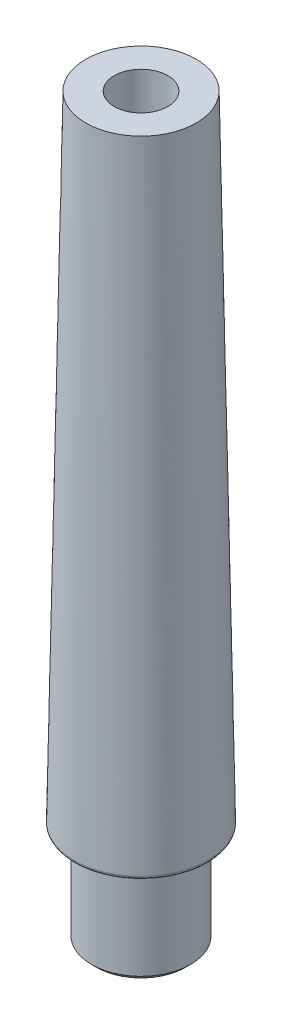
ISO-10303-21;
HEADER;
FILE_DESCRIPTION(('STEP AP214'),'2;1');
FILE_NAME('part.step','',(''),(''),'','','');
FILE_SCHEMA(('AUTOMOTIVE_DESIGN { 1 0 10303 214 1 1 1 1 }'));
ENDSEC;
DATA;
#1=APPLICATION_CONTEXT('core data for automotive mechanical design processes');
#2=APPLICATION_PROTOCOL_DEFINITION('international standard','automotive_design',2000,#1);
#3=PRODUCT_CONTEXT('',#1,'mechanical');
#4=PRODUCT('Part','Part','',(#3));
#5=PRODUCT_RELATED_PRODUCT_CATEGORY('part','',(#4));
#6=PRODUCT_DEFINITION_FORMATION('','',#4);
#7=PRODUCT_DEFINITION_CONTEXT('part definition',#1,'design');
#8=PRODUCT_DEFINITION('design','',#6,#7);
#9=PRODUCT_DEFINITION_SHAPE('','',#8);
#10=(LENGTH_UNIT() NAMED_UNIT(*) SI_UNIT(.MILLI.,.METRE.));
#11=(NAMED_UNIT(*) PLANE_ANGLE_UNIT() SI_UNIT($,.RADIAN.));
#12=(NAMED_UNIT(*) SI_UNIT($,.STERADIAN.) SOLID_ANGLE_UNIT());
#13=UNCERTAINTY_MEASURE_WITH_UNIT(LENGTH_MEASURE(1.E-05),#10,'distance_accuracy_value','');
#14=(GEOMETRIC_REPRESENTATION_CONTEXT(3) GLOBAL_UNCERTAINTY_ASSIGNED_CONTEXT((#13)) GLOBAL_UNIT_ASSIGNED_CONTEXT((#10,
#11,#12)) REPRESENTATION_CONTEXT('',''));
#15=CARTESIAN_POINT('',(0.,0.,0.));
#16=DIRECTION('',(0.,0.,1.));
#17=DIRECTION('',(1.,0.,0.));
#18=AXIS2_PLACEMENT_3D('',#15,#16,#17);
#19=CARTESIAN_POINT('',(0.,0.,0.));
#20=DIRECTION('',(0.,1.,0.));
#21=DIRECTION('',(0.,0.,1.));
#22=AXIS2_PLACEMENT_3D('',#19,#20,#21);
#23=PLANE('',#22);
#24=CARTESIAN_POINT('',(0.20959174613671,0.101841920504854,1.98724148629484));
#25=CARTESIAN_POINT('',(0.209786624715164,0.,1.98910750326632));
#26=CARTESIAN_POINT('',(0.199206440720225,0.,1.88779927815232));
#27=CARTESIAN_POINT('',(0.0986344808680384,0.101841837300837,1.99886008729085));
#28=CARTESIAN_POINT('',(0.0987257454415597,0.,2.00073693716713));
#29=CARTESIAN_POINT('',(0.0937731697168959,0.,1.89883526144194));
#30=CARTESIAN_POINT('',(-0.0131906222906671,0.101841791231215,2.00119648259656));
#31=CARTESIAN_POINT('',(-0.0132023273936145,0.,2.00307543820199));
#32=CARTESIAN_POINT('',(-0.0125705669595942,0.,1.9010570658988));
#33=CARTESIAN_POINT('',(-0.235841117106852,0.101841901744317,1.98740265066842));
#34=CARTESIAN_POINT('',(-0.236060197897312,0.,1.98926876827983));
#35=CARTESIAN_POINT('',(-0.22416516440641,0.,1.88795439500697));
#36=CARTESIAN_POINT('',(-0.346666687767183,0.101842058289998,1.97127579890718));
#37=CARTESIAN_POINT('',(-0.346990403742217,0.,1.97312695126309));
#38=CARTESIAN_POINT('',(-0.329416221392443,0.,1.87263312690344));
#39=CARTESIAN_POINT('',(-0.56541547290951,0.101842186376675,1.92023127720296));
#40=CARTESIAN_POINT('',(-0.565946254422076,0.,1.92203429641829));
#41=CARTESIAN_POINT('',(-0.537137694762737,0.,1.82415975369286));
#42=CARTESIAN_POINT('',(-0.673285045974327,0.101842155579139,1.88508109449888));
#43=CARTESIAN_POINT('',(-0.673917997721037,0.,1.88685075801916));
#44=CARTESIAN_POINT('',(-0.639556864284883,0.,1.79078701724868));
#45=CARTESIAN_POINT('',(-0.881439361014599,0.101841981642428,1.79698698989993));
#46=CARTESIAN_POINT('',(-0.88226888955693,0.,1.79867325541912));
#47=CARTESIAN_POINT('',(-0.837231737795207,0.,1.70712776837986));
#48=CARTESIAN_POINT('',(-0.981723601332979,0.101841838495831,1.74404189239411));
#49=CARTESIAN_POINT('',(-0.982647423425523,0.,1.74567818074565));
#50=CARTESIAN_POINT('',(-0.93248696799286,0.,1.6568401384822));
#51=CARTESIAN_POINT('',(-1.17082140912983,0.101841590496715,1.62273910342765));
#52=CARTESIAN_POINT('',(-1.17192231365546,0.,1.62426149584078));
#53=CARTESIAN_POINT('',(-1.11213934591246,0.,1.5415960026344));
#54=CARTESIAN_POINT('',(-1.25975128925553,0.101841485231657,1.55456143208162));
#55=CARTESIAN_POINT('',(-1.26093514642247,0.,1.55602006729398));
#56=CARTESIAN_POINT('',(-1.19664655330296,0.,1.47681081714188));
#57=CARTESIAN_POINT('',(-1.42508823373414,0.101841410837962,1.40443438367608));
#58=CARTESIAN_POINT('',(-1.42642613629574,0.,1.40575304219463));
#59=CARTESIAN_POINT('',(-1.35376867067339,0.,1.33414262592228));
#60=CARTESIAN_POINT('',(-1.50149489670984,0.101841441713686,1.32248456538077));
#61=CARTESIAN_POINT('',(-1.50290401116512,0.,1.32372690501835));
#62=CARTESIAN_POINT('',(-1.42638319948523,0.,1.25625920055017));
#63=CARTESIAN_POINT('',(-1.64053792342395,0.101841612104352,1.14592139070564));
#64=CARTESIAN_POINT('',(-1.64207697560821,0.,1.14699900264148));
#65=CARTESIAN_POINT('',(-1.55850740992732,0.,1.08848284124485));
#66=CARTESIAN_POINT('',(-1.70299168055144,0.101841752962407,1.05116353471164));
#67=CARTESIAN_POINT('',(-1.70458935704374,0.,1.05215249091494));
#68=CARTESIAN_POINT('',(-1.61784332479958,0.,0.998452896179452));
#69=CARTESIAN_POINT('',(-1.81096664176235,0.10184200564456,0.852416994059184));
#70=CARTESIAN_POINT('',(-1.81266610235884,0.,0.853219192092193));
#71=CARTESIAN_POINT('',(-1.72040644131914,0.,0.809665948354415));
#72=CARTESIAN_POINT('',(-1.85649266420474,0.101842117476917,0.74843094659457));
#73=CARTESIAN_POINT('',(-1.85823525128062,0.,0.749135062295837));
#74=CARTESIAN_POINT('',(-1.76363822689844,0.,0.710911438900184));
#75=CARTESIAN_POINT('',(-1.92885375460445,0.101842172342417,0.535025753641892));
#76=CARTESIAN_POINT('',(-1.93066489784057,0.,0.535527658658716));
#77=CARTESIAN_POINT('',(-1.83234982263291,0.,0.508281406563452));
#78=CARTESIAN_POINT('',(-1.95583449057663,0.101842116710001,0.425656354642715));
#79=CARTESIAN_POINT('',(-1.95767113515226,0.,0.426054364088914));
#80=CARTESIAN_POINT('',(-1.85796798331764,0.,0.40445281950068));
#81=CARTESIAN_POINT('',(-1.99098800236601,0.101841923071748,0.204061205011475));
#82=CARTESIAN_POINT('',(-1.99285757325564,0.,0.204250990183228));
#83=CARTESIAN_POINT('',(-1.89135592167895,0.,0.193948033647154));
#84=CARTESIAN_POINT('',(-1.99915397369964,0.101841785036131,0.0918344358236031));
#85=CARTESIAN_POINT('',(-2.00103096685221,0.,0.091919987984703));
#86=CARTESIAN_POINT('',(-1.89911924203307,0.,0.0872708187364532));
#87=CARTESIAN_POINT('',(-1.99688999671173,0.101841804047459,-0.132589258243576));
#88=CARTESIAN_POINT('',(-1.99876488502683,0.,-0.132712388334099));
#89=CARTESIAN_POINT('',(-1.89696867780493,0.,-0.12602350570676));
#90=CARTESIAN_POINT('',(-1.9864398842953,0.101841961414381,-0.244786018949943));
#91=CARTESIAN_POINT('',(-1.98830522189657,0.,-0.245013936731857));
#92=CARTESIAN_POINT('',(-1.88703562531587,0.,-0.232640424787774));
#93=CARTESIAN_POINT('',(-1.9466897496961,0.101842147984246,-0.46587881631567));
#94=CARTESIAN_POINT('',(-1.94851778331479,0.,-0.466315042044062));
#95=CARTESIAN_POINT('',(-1.84928357403477,0.,-0.442639662116363));
#96=CARTESIAN_POINT('',(-1.91739690977817,0.10184217723599,-0.574776094082254));
#97=CARTESIAN_POINT('',(-1.91919720507721,0.,-0.575315693152092));
#98=CARTESIAN_POINT('',(-1.82147139021704,0.,-0.546023197091696));
#99=CARTESIAN_POINT('',(-1.84086499086308,0.101842084571701,-0.785861290124338));
#100=CARTESIAN_POINT('',(-1.84259277047474,0.,-0.78660073419544));
#101=CARTESIAN_POINT('',(-1.74879814825031,0.,-0.746457769235742));
#102=CARTESIAN_POINT('',(-1.79364832003175,0.101841962843992,-0.888057399795212));
#103=CARTESIAN_POINT('',(-1.79533141090799,0.,-0.888893164649573));
#104=CARTESIAN_POINT('',(-1.7039583777682,0.,-0.843516536756602));
#105=CARTESIAN_POINT('',(-1.68276561934166,0.101841707987288,-1.08306096971095));
#106=CARTESIAN_POINT('',(-1.68434429413405,0.,-1.08407980667344));
#107=CARTESIAN_POINT('',(-1.59862794529841,0.,-1.02875654777536));
#108=CARTESIAN_POINT('',(-1.61909536213671,0.101841574855369,-1.17586600861031));
#109=CARTESIAN_POINT('',(-1.62061433349425,0.,-1.17697159539388));
#110=CARTESIAN_POINT('',(-1.53813326115833,0.,-1.11693550171949));
#111=CARTESIAN_POINT('',(-1.47719809817466,0.101841426796474,-1.34958606367919));
#112=CARTESIAN_POINT('',(-1.47858455685744,0.,-1.35085364579664));
#113=CARTESIAN_POINT('',(-1.40329336938258,0.,-1.28201478967761));
#114=CARTESIAN_POINT('',(-1.39896667713798,0.101841411905404,-1.43049746089198));
#115=CARTESIAN_POINT('',(-1.40028024798177,0.,-1.43184039882117));
#116=CARTESIAN_POINT('',(-1.32894396161975,0.,-1.35891169081358));
#117=CARTESIAN_POINT('',(-1.23010025058734,0.101841513651152,-1.57820394403317));
#118=CARTESIAN_POINT('',(-1.23125645715304,0.,-1.57968466713883));
#119=CARTESIAN_POINT('',(-1.16846999981948,0.,-1.49927748031658));
#120=CARTESIAN_POINT('',(-1.13946321852549,0.101841630309482,-1.6449967190355));
#121=CARTESIAN_POINT('',(-1.14053482706382,0.,-1.64653996112967));
#122=CARTESIAN_POINT('',(-1.08234352191313,0.,-1.56274417043805));
#123=CARTESIAN_POINT('',(-0.947447060014523,0.101841886195243,-1.76296883252411));
#124=CARTESIAN_POINT('',(-0.94833868154478,0.,-1.76462296285585));
#125=CARTESIAN_POINT('',(-0.899927886552734,0.,-1.67481850610216));
#126=CARTESIAN_POINT('',(-0.845985645321487,0.10184202560056,-1.81401511237491));
#127=CARTESIAN_POINT('',(-0.846781761181408,0.,-1.81571748240332));
#128=CARTESIAN_POINT('',(-0.803560905013655,0.,-1.72329952868251));
#129=CARTESIAN_POINT('',(-0.635902534338017,0.10184216704634,-1.89802994605908));
#130=CARTESIAN_POINT('',(-0.636500100347698,0.,-1.89981188033636));
#131=CARTESIAN_POINT('',(-0.60405953766227,0.,-1.80308258198989));
#132=CARTESIAN_POINT('',(-0.527290488298387,0.101842169268285,-1.93102232642793));
#133=CARTESIAN_POINT('',(-0.527785161561928,0.,-1.9328355359734));
#134=CARTESIAN_POINT('',(-0.500934273428609,0.,-1.83440725476428));
#135=CARTESIAN_POINT('',(-0.348269924671829,0.101842056671137,-1.96907831324272));
#136=CARTESIAN_POINT('',(-0.348595193583393,0.,-1.97092739256911));
#137=CARTESIAN_POINT('',(-0.330937993829269,0.,-1.8705459548386));
#138=CARTESIAN_POINT('',(-0.279041736731691,0.101841986043417,-1.97999165715441));
#139=CARTESIAN_POINT('',(-0.279301606129733,0.,-1.98185094394902));
#140=CARTESIAN_POINT('',(-0.265195037362604,0.,-1.8809116000953));
#141=CARTESIAN_POINT('',(-0.139889965546331,0.101841854728371,-1.99451760342703));
#142=CARTESIAN_POINT('',(-0.140019663887183,0.,-1.99639037010659));
#143=CARTESIAN_POINT('',(-0.13297862938437,0.,-1.894711931133));
#144=CARTESIAN_POINT('',(-0.0699662598403997,0.101841794042829,-1.99812889639334));
#145=CARTESIAN_POINT('',(-0.070031180137041,0.,-2.00000493987468));
#146=CARTESIAN_POINT('',(-0.0665050490065609,0.,-1.89814537383994));
#147=CARTESIAN_POINT('',(0.111941514836488,0.101841790804068,-1.99811608022222));
#148=CARTESIAN_POINT('',(0.11204538128634,0.,-1.99999209651843));
#149=CARTESIAN_POINT('',(0.106403800160983,0.,-1.89813381862608));
#150=CARTESIAN_POINT('',(0.223991959497409,0.101841940964756,-1.98885140856701));
#151=CARTESIAN_POINT('',(0.224200338816815,0.,-1.99071898934076));
#152=CARTESIAN_POINT('',(0.212888153533726,0.,-1.88932642447468));
#153=CARTESIAN_POINT('',(0.445110231257135,0.10184213351798,-1.95152345456532));
#154=CARTESIAN_POINT('',(0.445526780386598,0.,-1.95335604540881));
#155=CARTESIAN_POINT('',(0.422918811155164,0.,-1.85387375725744));
#156=CARTESIAN_POINT('',(0.554175423137349,0.101842175818156,-1.92344408742881));
#157=CARTESIAN_POINT('',(0.554695503482773,0.,-1.92525011047038));
#158=CARTESIAN_POINT('',(0.526462522414235,0.,-1.82721322145126));
#159=CARTESIAN_POINT('',(0.765835057174021,0.10184210232152,-1.84929755589256));
#160=CARTESIAN_POINT('',(0.766555585500162,0.,-1.85103332353306));
#161=CARTESIAN_POINT('',(0.727440361261778,0.,-1.7568058445859));
#162=CARTESIAN_POINT('',(0.868436627537755,0.101841986702173,-1.80325062459318));
#163=CARTESIAN_POINT('',(0.869253911976304,0.,-1.80494279028934));
#164=CARTESIAN_POINT('',(0.82488121848173,0.,-1.71307822259293));
#165=CARTESIAN_POINT('',(1.06459595155258,0.10184173394998,-1.69454558094164));
#166=CARTESIAN_POINT('',(1.0655974987086,0.,-1.69613532057263));
#167=CARTESIAN_POINT('',(1.01121375360273,0.,-1.60981935359377));
#168=CARTESIAN_POINT('',(1.15813694657064,0.101841596778455,-1.63185746030944));
#169=CARTESIAN_POINT('',(1.15922597401334,0.,-1.63338838139527));
#170=CARTESIAN_POINT('',(1.10008958797145,0.,-1.55025955690023));
#171=CARTESIAN_POINT('',(1.33346783448404,0.101841435025332,-1.49177985634368));
#172=CARTESIAN_POINT('',(1.33472040327922,0.,-1.49317991053772));
#173=CARTESIAN_POINT('',(1.26669702903985,0.,-1.41715080550618));
#174=CARTESIAN_POINT('',(1.4152544203186,0.10184141047536,-1.41438624984051));
#175=CARTESIAN_POINT('',(1.41658315742774,0.,-1.41571418360224));
#176=CARTESIAN_POINT('',(1.34442549945568,0.,-1.343597927375));
#177=CARTESIAN_POINT('',(1.5646915556154,0.10184149683326,-1.24719968646306));
#178=CARTESIAN_POINT('',(1.56615965302828,0.,-1.24837184004973));
#179=CARTESIAN_POINT('',(1.48643717999934,0.,-1.18471908130694));
#180=CARTESIAN_POINT('',(1.63236624548098,0.101841607507548,-1.15742834794588));
#181=CARTESIAN_POINT('',(1.63389765386736,0.,-1.15851674121825));
#182=CARTESIAN_POINT('',(1.55074335106082,0.,-1.09941364004036));
#183=CARTESIAN_POINT('',(1.75233186109933,0.101841858976327,-0.966908770527962));
#184=CARTESIAN_POINT('',(1.75397596111982,0.,-0.967818681493157));
#185=CARTESIAN_POINT('',(1.66471480042512,0.,-0.918413988162645));
#186=CARTESIAN_POINT('',(1.80447572092669,0.10184200003823,-0.866067250462673));
#187=CARTESIAN_POINT('',(1.80616906478741,0.,-0.866882305048728));
#188=CARTESIAN_POINT('',(1.71424012300411,0.,-0.822631523335256));
#189=CARTESIAN_POINT('',(1.89085668706965,0.101842162538818,-0.656933182061674));
#190=CARTESIAN_POINT('',(1.89263182668281,0.,-0.657550647605574));
#191=CARTESIAN_POINT('',(1.79627112185542,0.,-0.624030422115726));
#192=CARTESIAN_POINT('',(1.92509480561908,0.101842183984265,-0.548641055309739));
#193=CARTESIAN_POINT('',(1.92690243057996,0.,-0.549155909987867));
#194=CARTESIAN_POINT('',(1.82877776021524,0.,-0.521212183836287));
#195=CARTESIAN_POINT('',(1.97425384831793,0.101842042387622,-0.329222088629866));
#196=CARTESIAN_POINT('',(1.9761077935201,0.,-0.329529363322418));
#197=CARTESIAN_POINT('',(1.87546141874693,0.,-0.312847651710985));
#198=CARTESIAN_POINT('',(1.98940773921031,0.101841881616912,-0.218146661542208));
#199=CARTESIAN_POINT('',(1.99127571206153,0.,-0.21834921798498));
#200=CARTESIAN_POINT('',(1.88985949254658,0.,-0.20735062354661));
#201=CARTESIAN_POINT('',(2.00123385654976,0.101841785554993,0.00485394520498472));
#202=CARTESIAN_POINT('',(2.00311283267744,0.,0.00485899719244261));
#203=CARTESIAN_POINT('',(1.90109309296903,0.,0.00458074383601433));
#204=CARTESIAN_POINT('',(1.99790298911586,0.101841850301529,0.116779263984007));
#205=CARTESIAN_POINT('',(1.99977896067106,0.,0.116887461907655));
#206=CARTESIAN_POINT('',(1.89792567957365,0.,0.111015236985554));
#207=CARTESIAN_POINT('',(1.97247535444291,0.101842026270261,0.339986928218071));
#208=CARTESIAN_POINT('',(1.97432759233707,0.,0.340303833180597));
#209=CARTESIAN_POINT('',(1.87377341069213,0.,0.323102290498914));
#210=CARTESIAN_POINT('',(1.95016437847766,0.101842138015576,0.451247276373043));
#211=CARTESIAN_POINT('',(1.95199566192629,0.,0.45166980660524));
#212=CARTESIAN_POINT('',(1.85258517356155,0.,0.428731982497125));
#213=CARTESIAN_POINT('',(1.88688078221296,0.101842168127301,0.668276067414662));
#214=CARTESIAN_POINT('',(1.88865218417329,0.,0.668904378305075));
#215=CARTESIAN_POINT('',(1.79249313863914,0.,0.634798909333062));
#216=CARTESIAN_POINT('',(1.84591305874579,0.101842086544431,0.774045943274447));
#217=CARTESIAN_POINT('',(1.84764559787259,0.,0.774774196278108));
#218=CARTESIAN_POINT('',(1.75359398942695,0.,0.73523749898056));
#219=CARTESIAN_POINT('',(1.74732547791369,0.101841858215899,0.975745798643539));
#220=CARTESIAN_POINT('',(1.748964879966,0.,0.976664000018366));
#221=CARTESIAN_POINT('',(1.65995810681092,0.,0.926809044330899));
#222=CARTESIAN_POINT('',(1.68992803018451,0.101841712327376,1.07178542448774));
#223=CARTESIAN_POINT('',(1.69151341694991,0.,1.07279368534927));
#224=CARTESIAN_POINT('',(1.60543289290864,0.,1.01804562410907));
#225=CARTESIAN_POINT('',(1.55991532603661,0.101841497804932,1.2531397476492));
#226=CARTESIAN_POINT('',(1.56137896706636,0.,1.25431746634249));
#227=CARTESIAN_POINT('',(1.48189967272224,0.,1.19036054830993));
#228=CARTESIAN_POINT('',(1.48727322022995,0.101841429308695,1.33843509191312));
#229=CARTESIAN_POINT('',(1.48866907154547,0.,1.33969227371661));
#230=CARTESIAN_POINT('',(1.41286611355348,0.,1.27142056141604));
#231=CARTESIAN_POINT('',(1.32807194428487,0.10184143440241,1.49662569609319));
#232=CARTESIAN_POINT('',(1.32931947196101,0.,1.49803026735013));
#233=CARTESIAN_POINT('',(1.2615721293668,0.,1.42175407838601));
#234=CARTESIAN_POINT('',(1.24137974947424,0.101841509432952,1.56938715874946));
#235=CARTESIAN_POINT('',(1.24254650351613,0.,1.57085964833855));
#236=CARTESIAN_POINT('',(1.17918527625372,0.,1.49090040698809));
#237=CARTESIAN_POINT('',(1.05713011783352,0.101841732568976,1.69923468911669));
#238=CARTESIAN_POINT('',(1.05812465389577,0.,1.70082881822838));
#239=CARTESIAN_POINT('',(1.00412226586325,0.,1.61427463487709));
#240=CARTESIAN_POINT('',(0.959592070537107,0.101841880545626,1.75634811761075));
#241=CARTESIAN_POINT('',(0.960495100009772,0.,1.75799602351965));
#242=CARTESIAN_POINT('',(0.911464471229543,0.,1.66852857400778));
#243=CARTESIAN_POINT('',(0.756105945821358,0.101842101911442,1.85333859580509));
#244=CARTESIAN_POINT('',(0.756817248126996,0.,1.85507817011982));
#245=CARTESIAN_POINT('',(0.718201178821221,0.,1.7606453684956));
#246=CARTESIAN_POINT('',(0.650149338064803,0.101842175223885,1.89319789172254));
#247=CARTESIAN_POINT('',(0.650760479330817,0.,1.894975284663));
#248=CARTESIAN_POINT('',(0.617587620157681,0.,1.79849134080085));
#249=CARTESIAN_POINT('',(0.432955318438329,0.101842126584072,1.9542811659619));
#250=CARTESIAN_POINT('',(0.433360539692391,0.,1.95611633204708));
#251=CARTESIAN_POINT('',(0.411362235157569,0.,1.85649438410429));
#252=CARTESIAN_POINT('',(0.321716631674126,0.101842004584438,1.97550062098396));
#253=CARTESIAN_POINT('',(0.322016310235937,0.,1.97735568104045));
#254=CARTESIAN_POINT('',(0.305749202155978,0.,1.87664716152305));
#255=CARTESIAN_POINT('',(0.20959174613671,0.101841920504854,1.98724148629484));
#256=CARTESIAN_POINT('',(0.209786624715164,0.,1.98910750326632));
#257=CARTESIAN_POINT('',(0.199206440720225,0.,1.88779927815232));
#258=(BOUNDED_SURFACE() B_SPLINE_SURFACE(3,2,((#24,#25,#26),(#27,#28,#29),(#30,#31,#32),(#33,
#34,#35),(#36,#37,#38),(#39,#40,#41),(#42,#43,#44),(#45,#46,#47),(#48,#49,#50),(#51,#52,#53),
(#54,#55,#56),(#57,#58,#59),(#60,#61,#62),(#63,#64,#65),(#66,#67,#68),(#69,#70,#71),(#72,#73,
#74),(#75,#76,#77),(#78,#79,#80),(#81,#82,#83),(#84,#85,#86),(#87,#88,#89),(#90,#91,#92),(#93,
#94,#95),(#96,#97,#98),(#99,#100,#101),(#102,#103,#104),(#105,#106,#107),(#108,#109,#110),(#111,
#112,#113),(#114,#115,#116),(#117,#118,#119),(#120,#121,#122),(#123,#124,#125),(#126,#127,#128),
(#129,#130,#131),(#132,#133,#134),(#135,#136,#137),(#138,#139,#140),(#141,#142,#143),(#144,#145,
#146),(#147,#148,#149),(#150,#151,#152),(#153,#154,#155),(#156,#157,#158),(#159,#160,#161),
(#162,#163,#164),(#165,#166,#167),(#168,#169,#170),(#171,#172,#173),(#174,#175,#176),(#177,#178,
#179),(#180,#181,#182),(#183,#184,#185),(#186,#187,#188),(#189,#190,#191),(#192,#193,#194),
(#195,#196,#197),(#198,#199,#200),(#201,#202,#203),(#204,#205,#206),(#207,#208,#209),(#210,#211,
#212),(#213,#214,#215),(#216,#217,#218),(#219,#220,#221),(#222,#223,#224),(#225,#226,#227),
(#228,#229,#230),(#231,#232,#233),(#234,#235,#236),(#237,#238,#239),(#240,#241,#242),(#243,#244,
#245),(#246,#247,#248),(#249,#250,#251),(#252,#253,#254),(#255,#256,#257)),.UNSPECIFIED.,.T.,
.F.,.F.) B_SPLINE_SURFACE_WITH_KNOTS((4,2,2,2,2,2,2,2,2,2,2,2,2,2,2,2,2,2,2,2,2,2,2,2,2,2,2,2,2,
2,2,2,2,2,2,2,2,2,4),(3,3),(0.,0.317654766610884,0.635251468474972,0.956820674278054,
1.27841112854546,1.59638509310116,1.91436924693616,2.23629856829809,2.55813618449763,
2.87741604634089,3.19681135973695,3.51655283798156,3.83617251282647,4.15539391185763,
4.47469740869567,4.79409786189076,5.11355055391289,5.4356330294015,5.75728940679698,
5.95661422332652,6.155974779364,6.47493884422022,6.79417594176959,7.11305458217584,
7.43251219432912,7.75205950952315,8.07105562620058,8.39298281057344,8.71489179403448,
9.03283179796594,9.35082501861644,9.67245544801235,9.99400150775376,10.3113854682207,
10.6293331787314,10.9504889062566,11.2710794523152,11.591999093057,11.9129965893491),(0.,1.),
.UNSPECIFIED.) GEOMETRIC_REPRESENTATION_ITEM() RATIONAL_B_SPLINE_SURFACE(((1.,0.700564342138346,
1.),(1.,0.70056463905631,1.),(1.,0.700564803458061,1.),(1.,0.700564409086122,1.),(1.,
0.700563850444617,1.),(1.,0.700563393360629,1.),(1.,0.700563503263324,1.),(1.,0.700564123965665,
1.),(1.,0.700564634791801,1.),(1.,0.700565519788611,1.),(1.,0.700565895431461,1.),(1.,
0.700566160908629,1.),(1.,0.700566050727379,1.),(1.,0.700565442680584,1.),(1.,0.700564940022075,
1.),(1.,0.700564038313013,1.),(1.,0.700563639232986,1.),(1.,0.700563443442476,1.),(1.,
0.70056364196996,1.),(1.,0.700564332978263,1.),(1.,0.700564825565349,1.),(1.,0.700564757722397,
1.),(1.,0.700564196150505,1.),(1.,0.70056353036615,1.),(1.,0.70056342597954,1.),(1.,
0.700563756657025,1.),(1.,0.700564191049077,1.),(1.,0.700565100517981,1.),(1.,0.700565575605268,
1.),(1.,0.700566103960061,1.),(1.,0.700566157099437,1.),(1.,0.700565794015248,1.),(1.,
0.700565377714915,1.),(1.,0.700564464574072,1.),(1.,0.700563967098754,1.),(1.,0.700563462341911,
1.),(1.,0.700563454412755,1.),(1.,0.700563856221745,1.),(1.,0.700564108260577,1.),(1.,
0.700564576865139,1.),(1.,0.7005647934245,1.),(1.,0.700564804982081,1.),(1.,0.70056426912608,
1.),(1.,0.700563581989814,1.),(1.,0.700563431039138,1.),(1.,0.700563693315836,1.),(1.,
0.700564105909911,1.),(1.,0.700565007868854,1.),(1.,0.70056549737175,1.),(1.,0.70056607459505,
1.),(1.,0.700566162202597,1.),(1.,0.700565854030634,1.),(1.,0.700565459084676,1.),(1.,
0.700564561706136,1.),(1.,0.700564058319265,1.),(1.,0.70056347842731,1.),(1.,0.700563401898092,
1.),(1.,0.700563907193106,1.),(1.,0.700564480911797,1.),(1.,0.700564823713923,1.),(1.,
0.700564592662663,1.),(1.,0.700563964708888,1.),(1.,0.700563565939594,1.),(1.,0.700563458484395,
1.),(1.,0.700563749617496,1.),(1.,0.700564564419692,1.),(1.,0.700565085030057,1.),(1.,
0.700565850563372,1.),(1.,0.700566094994991,1.),(1.,0.700566076817847,1.),(1.,0.700565809068283,
1.),(1.,0.700565012796945,1.),(1.,0.700564484734916,1.),(1.,0.700563694779485,1.),(1.,
0.700563433159868,1.),(1.,0.700563606733529,1.),(1.,0.700564042095869,1.),(1.,0.700564342138346,1.))) REPRESENTATION_ITEM('') SURFACE());
#259=CARTESIAN_POINT('',(0.199206440720225,0.,1.88779927815232));
#260=CARTESIAN_POINT('',(0.0937731697168961,0.,1.89883526144194));
#261=CARTESIAN_POINT('',(-0.0125705669595941,0.,1.9010570658988));
#262=CARTESIAN_POINT('',(-0.22416516440641,0.,1.88795439500697));
#263=CARTESIAN_POINT('',(-0.329416221392443,0.,1.87263312690344));
#264=CARTESIAN_POINT('',(-0.537137694762737,0.,1.82415975369286));
#265=CARTESIAN_POINT('',(-0.639556864284883,0.,1.79078701724868));
#266=CARTESIAN_POINT('',(-0.837231737795207,0.,1.70712776837986));
#267=CARTESIAN_POINT('',(-0.93248696799286,0.,1.6568401384822));
#268=CARTESIAN_POINT('',(-1.11213934591246,0.,1.5415960026344));
#269=CARTESIAN_POINT('',(-1.19664655330296,0.,1.47681081714188));
#270=CARTESIAN_POINT('',(-1.35376867067339,0.,1.33414262592228));
#271=CARTESIAN_POINT('',(-1.42638319948523,0.,1.25625920055017));
#272=CARTESIAN_POINT('',(-1.55850740992732,0.,1.08848284124485));
#273=CARTESIAN_POINT('',(-1.61784332479958,0.,0.998452896179452));
#274=CARTESIAN_POINT('',(-1.72040644131914,0.,0.809665948354415));
#275=CARTESIAN_POINT('',(-1.76363822689844,0.,0.710911438900184));
#276=CARTESIAN_POINT('',(-1.83234982263291,0.,0.508281406563452));
#277=CARTESIAN_POINT('',(-1.85796798331764,0.,0.40445281950068));
#278=CARTESIAN_POINT('',(-1.89135592167895,0.,0.193948033647154));
#279=CARTESIAN_POINT('',(-1.89911924203307,0.,0.0872708187364532));
#280=CARTESIAN_POINT('',(-1.89696867780493,0.,-0.12602350570676));
#281=CARTESIAN_POINT('',(-1.88703562531587,0.,-0.232640424787774));
#282=CARTESIAN_POINT('',(-1.84928357403477,0.,-0.442639662116363));
#283=CARTESIAN_POINT('',(-1.82147139021704,0.,-0.546023197091696));
#284=CARTESIAN_POINT('',(-1.74879814825031,0.,-0.746457769235742));
#285=CARTESIAN_POINT('',(-1.7039583777682,0.,-0.843516536756602));
#286=CARTESIAN_POINT('',(-1.59862794529841,0.,-1.02875654777536));
#287=CARTESIAN_POINT('',(-1.53813326115833,0.,-1.11693550171949));
#288=CARTESIAN_POINT('',(-1.40329336938258,0.,-1.28201478967761));
#289=CARTESIAN_POINT('',(-1.32894396161975,0.,-1.35891169081358));
#290=CARTESIAN_POINT('',(-1.16846999981948,0.,-1.49927748031658));
#291=CARTESIAN_POINT('',(-1.08234352191313,0.,-1.56274417043805));
#292=CARTESIAN_POINT('',(-0.899927886552734,0.,-1.67481850610216));
#293=CARTESIAN_POINT('',(-0.803560905013655,0.,-1.72329952868251));
#294=CARTESIAN_POINT('',(-0.60405953766227,0.,-1.80308258198989));
#295=CARTESIAN_POINT('',(-0.500934273428609,0.,-1.83440725476428));
#296=CARTESIAN_POINT('',(-0.330937993829269,0.,-1.8705459548386));
#297=CARTESIAN_POINT('',(-0.265195037362604,0.,-1.8809116000953));
#298=CARTESIAN_POINT('',(-0.13297862938437,0.,-1.894711931133));
#299=CARTESIAN_POINT('',(-0.0665050490065608,0.,-1.89814537383994));
#300=CARTESIAN_POINT('',(0.106403800160983,0.,-1.89813381862608));
#301=CARTESIAN_POINT('',(0.212888153533726,0.,-1.88932642447468));
#302=CARTESIAN_POINT('',(0.422918811155164,0.,-1.85387375725744));
#303=CARTESIAN_POINT('',(0.526462522414235,0.,-1.82721322145126));
#304=CARTESIAN_POINT('',(0.727440361261778,0.,-1.7568058445859));
#305=CARTESIAN_POINT('',(0.82488121848173,0.,-1.71307822259293));
#306=CARTESIAN_POINT('',(1.01121375360273,0.,-1.60981935359377));
#307=CARTESIAN_POINT('',(1.10008958797145,0.,-1.55025955690023));
#308=CARTESIAN_POINT('',(1.26669702903985,0.,-1.41715080550618));
#309=CARTESIAN_POINT('',(1.34442549945568,0.,-1.343597927375));
#310=CARTESIAN_POINT('',(1.48643717999934,0.,-1.18471908130694));
#311=CARTESIAN_POINT('',(1.55074335106082,0.,-1.09941364004036));
#312=CARTESIAN_POINT('',(1.66471480042512,0.,-0.918413988162645));
#313=CARTESIAN_POINT('',(1.71424012300411,0.,-0.822631523335256));
#314=CARTESIAN_POINT('',(1.79627112185542,0.,-0.624030422115726));
#315=CARTESIAN_POINT('',(1.82877776021524,0.,-0.521212183836288));
#316=CARTESIAN_POINT('',(1.87546141874693,0.,-0.312847651710985));
#317=CARTESIAN_POINT('',(1.88985949254658,0.,-0.20735062354661));
#318=CARTESIAN_POINT('',(1.90109309296903,0.,0.00458074383601459));
#319=CARTESIAN_POINT('',(1.89792567957365,0.,0.111015236985554));
#320=CARTESIAN_POINT('',(1.87377341069213,0.,0.323102290498914));
#321=CARTESIAN_POINT('',(1.85258517356155,0.,0.428731982497126));
#322=CARTESIAN_POINT('',(1.79249313863914,0.,0.634798909333063));
#323=CARTESIAN_POINT('',(1.75359398942695,0.,0.73523749898056));
#324=CARTESIAN_POINT('',(1.65995810681092,0.,0.926809044330898));
#325=CARTESIAN_POINT('',(1.60543289290864,0.,1.01804562410907));
#326=CARTESIAN_POINT('',(1.48189967272224,0.,1.19036054830993));
#327=CARTESIAN_POINT('',(1.41286611355348,0.,1.27142056141604));
#328=CARTESIAN_POINT('',(1.2615721293668,0.,1.42175407838601));
#329=CARTESIAN_POINT('',(1.17918527625372,0.,1.49090040698809));
#330=CARTESIAN_POINT('',(1.00412226586325,0.,1.61427463487709));
#331=CARTESIAN_POINT('',(0.911464471229543,0.,1.66852857400778));
#332=CARTESIAN_POINT('',(0.718201178821221,0.,1.7606453684956));
#333=CARTESIAN_POINT('',(0.617587620157681,0.,1.79849134080085));
#334=CARTESIAN_POINT('',(0.411362235157569,0.,1.85649438410429));
#335=CARTESIAN_POINT('',(0.305749202155978,0.,1.87664716152305));
#336=CARTESIAN_POINT('',(0.199206440720225,0.,1.88779927815232));
#337=B_SPLINE_CURVE_WITH_KNOTS('',3,(#259,#260,#261,#262,#263,#264,#265,#266,#267,#268,#269,
#270,#271,#272,#273,#274,#275,#276,#277,#278,#279,#280,#281,#282,#283,#284,#285,#286,#287,#288,
#289,#290,#291,#292,#293,#294,#295,#296,#297,#298,#299,#300,#301,#302,#303,#304,#305,#306,#307,
#308,#309,#310,#311,#312,#313,#314,#315,#316,#317,#318,#319,#320,#321,#322,#323,#324,#325,#326,
#327,#328,#329,#330,#331,#332,#333,#334,#335,#336),.UNSPECIFIED.,.T.,.F.,(4,2,2,2,2,2,2,2,2,2,2,
2,2,2,2,2,2,2,2,2,2,2,2,2,2,2,2,2,2,2,2,2,2,2,2,2,2,2,4),(0.,0.317654766610884,
0.635251468474972,0.956820674278054,1.27841112854546,1.59638509310116,1.91436924693616,
2.23629856829809,2.55813618449763,2.87741604634089,3.19681135973695,3.51655283798156,
3.83617251282647,4.15539391185763,4.47469740869567,4.79409786189076,5.11355055391289,
5.4356330294015,5.75728940679698,5.95661422332652,6.155974779364,6.47493884422022,
6.79417594176959,7.11305458217584,7.43251219432912,7.75205950952315,8.07105562620058,
8.39298281057344,8.71489179403448,9.03283179796594,9.35082501861644,9.67245544801235,
9.99400150775376,10.3113854682207,10.6293331787314,10.9504889062566,11.2710794523152,
11.591999093057,11.9129965893491),.UNSPECIFIED.);
#338=CARTESIAN_POINT('',(0.199206440720225,0.,1.88779927815232));
#339=VERTEX_POINT('',#338);
#340=EDGE_CURVE('E141',#339,#339,#337,.T.);
#341=ORIENTED_EDGE('',*,*,#340,.T.);
#342=EDGE_LOOP('',(#341));
#343=FACE_BOUND('',#342,.T.);
#344=CARTESIAN_POINT('',(0.,0.,0.));
#345=DIRECTION('',(0.,1.,0.));
#346=DIRECTION('',(0.,0.,1.));
#347=AXIS2_PLACEMENT_3D('',#344,#345,#346);
#348=CIRCLE('',#347,1.48);
#349=CARTESIAN_POINT('',(0.,0.,1.48));
#350=VERTEX_POINT('',#349);
#351=EDGE_CURVE('E83',#350,#350,#348,.T.);
#352=ORIENTED_EDGE('',*,*,#351,.T.);
#353=EDGE_LOOP('',(#352));
#354=FACE_BOUND('',#353,.T.);
#355=ADVANCED_FACE('F64',(#343,#354),#23,.F.);
#356=CARTESIAN_POINT('',(0.,19.,0.));
#357=DIRECTION('',(0.,1.,0.));
#358=DIRECTION('',(0.,0.,1.));
#359=AXIS2_PLACEMENT_3D('',#356,#357,#358);
#360=PLANE('',#359);
#361=CARTESIAN_POINT('',(0.,19.,0.));
#362=DIRECTION('',(0.,1.,0.));
#363=DIRECTION('',(0.,0.,1.));
#364=AXIS2_PLACEMENT_3D('',#361,#362,#363);
#365=CIRCLE('',#364,0.799999999999999);
#366=CARTESIAN_POINT('',(0.,19.,0.799999999999999));
#367=VERTEX_POINT('',#366);
#368=EDGE_CURVE('E84',#367,#367,#365,.T.);
#369=ORIENTED_EDGE('',*,*,#368,.F.);
#370=EDGE_LOOP('',(#369));
#371=FACE_BOUND('',#370,.T.);
#372=CARTESIAN_POINT('',(0.,19.,0.));
#373=DIRECTION('',(0.,1.,0.));
#374=DIRECTION('',(0.,0.,1.));
#375=AXIS2_PLACEMENT_3D('',#372,#373,#374);
#376=CIRCLE('',#375,1.65);
#377=CARTESIAN_POINT('',(0.,19.,1.65));
#378=VERTEX_POINT('',#377);
#379=EDGE_CURVE('E87',#378,#378,#376,.T.);
#380=ORIENTED_EDGE('',*,*,#379,.T.);
#381=EDGE_LOOP('',(#380));
#382=FACE_BOUND('',#381,.T.);
#383=ADVANCED_FACE('F114',(#371,#382),#360,.T.);
#384=CARTESIAN_POINT('',(0.,19.,1.65));
#385=CARTESIAN_POINT('',(0.,12.6666666666667,1.76666666666667));
#386=CARTESIAN_POINT('',(0.,6.33333333333333,1.88333333333333));
#387=CARTESIAN_POINT('',(0.,0.,2.));
#388=CARTESIAN_POINT('',(-0.0455329883186558,19.,1.65));
#389=CARTESIAN_POINT('',(-0.0487524925432073,12.6666666666667,1.76666666666667));
#390=CARTESIAN_POINT('',(-0.0519719967677588,6.33333333333333,1.88333333333333));
#391=CARTESIAN_POINT('',(-0.0551915009923103,0.,2.));
#392=CARTESIAN_POINT('',(-0.135742367292236,19.,1.64630329883187));
#393=CARTESIAN_POINT('',(-0.145340312454313,12.6666666666667,1.76270858258765));
#394=CARTESIAN_POINT('',(-0.154938257616391,6.33333333333333,1.87911386634344));
#395=CARTESIAN_POINT('',(-0.164536202778468,0.,1.99551915009923));
#396=CARTESIAN_POINT('',(-0.268060627235753,19.,1.63009415910092));
#397=CARTESIAN_POINT('',(-0.287014408959493,12.6666666666667,1.74535334206765));
#398=CARTESIAN_POINT('',(-0.305968190683233,6.33333333333333,1.86061252503439));
#399=CARTESIAN_POINT('',(-0.324921972406974,0.,1.97587170800112));
#400=CARTESIAN_POINT('',(-0.396957063136755,19.,1.60364694691689));
#401=CARTESIAN_POINT('',(-0.425024734267637,12.6666666666667,1.71703612498173));
#402=CARTESIAN_POINT('',(-0.453092405398519,6.33333333333333,1.83042530304656));
#403=CARTESIAN_POINT('',(-0.481160076529401,0.,1.94381448111139));
#404=CARTESIAN_POINT('',(-1.14724864113372,19.,1.3860913322482));
#405=CARTESIAN_POINT('',(-1.22836723192095,12.6666666666667,1.48409779008393));
#406=CARTESIAN_POINT('',(-1.30948582270818,6.33333333333333,1.58210424791967));
#407=CARTESIAN_POINT('',(-1.39060441349542,0.,1.6801107057554));
#408=CARTESIAN_POINT('',(-1.65,19.,0.728527813098492));
#409=CARTESIAN_POINT('',(-1.76666666666667,12.6666666666667,0.780039880691314));
#410=CARTESIAN_POINT('',(-1.88333333333333,6.33333333333333,0.831551948284137));
#411=CARTESIAN_POINT('',(-2.,0.,0.88306401587696));
#412=CARTESIAN_POINT('',(-1.65,19.,-0.910659766373116));
#413=CARTESIAN_POINT('',(-1.76666666666667,12.6666666666667,-0.975049850864144));
#414=CARTESIAN_POINT('',(-1.88333333333333,6.33333333333333,-1.03943993535517));
#415=CARTESIAN_POINT('',(-2.,0.,-1.1038300198462));
#416=CARTESIAN_POINT('',(-0.910659766373115,19.,-1.65));
#417=CARTESIAN_POINT('',(-0.975049850864144,12.6666666666667,-1.76666666666667));
#418=CARTESIAN_POINT('',(-1.03943993535517,6.33333333333333,-1.88333333333333));
#419=CARTESIAN_POINT('',(-1.1038300198462,0.,-2.));
#420=CARTESIAN_POINT('',(0.910659766373115,19.,-1.65));
#421=CARTESIAN_POINT('',(0.975049850864144,12.6666666666667,-1.76666666666667));
#422=CARTESIAN_POINT('',(1.03943993535517,6.33333333333333,-1.88333333333333));
#423=CARTESIAN_POINT('',(1.1038300198462,0.,-2.));
#424=CARTESIAN_POINT('',(1.65,19.,-0.910659766373115));
#425=CARTESIAN_POINT('',(1.76666666666667,12.6666666666667,-0.975049850864144));
#426=CARTESIAN_POINT('',(1.88333333333333,6.33333333333333,-1.03943993535517));
#427=CARTESIAN_POINT('',(2.,0.,-1.1038300198462));
#428=CARTESIAN_POINT('',(1.65,19.,0.728527813098492));
#429=CARTESIAN_POINT('',(1.76666666666667,12.6666666666667,0.780039880691315));
#430=CARTESIAN_POINT('',(1.88333333333333,6.33333333333333,0.831551948284138));
#431=CARTESIAN_POINT('',(2.,0.,0.883064015876961));
#432=CARTESIAN_POINT('',(1.14724864113372,19.,1.3860913322482));
#433=CARTESIAN_POINT('',(1.22836723192095,12.6666666666667,1.48409779008394));
#434=CARTESIAN_POINT('',(1.30948582270818,6.33333333333333,1.58210424791967));
#435=CARTESIAN_POINT('',(1.39060441349542,0.,1.6801107057554));
#436=CARTESIAN_POINT('',(0.396957063136755,19.,1.60364694691689));
#437=CARTESIAN_POINT('',(0.425024734267637,12.6666666666667,1.71703612498173));
#438=CARTESIAN_POINT('',(0.453092405398518,6.33333333333333,1.83042530304656));
#439=CARTESIAN_POINT('',(0.4811600765294,0.,1.94381448111139));
#440=CARTESIAN_POINT('',(0.268060627235752,19.,1.63009415910092));
#441=CARTESIAN_POINT('',(0.287014408959493,12.6666666666667,1.74535334206765));
#442=CARTESIAN_POINT('',(0.305968190683233,6.33333333333333,1.86061252503439));
#443=CARTESIAN_POINT('',(0.324921972406973,0.,1.97587170800112));
#444=CARTESIAN_POINT('',(0.135742367292236,19.,1.64630329883187));
#445=CARTESIAN_POINT('',(0.145340312454313,12.6666666666667,1.76270858258765));
#446=CARTESIAN_POINT('',(0.15493825761639,6.33333333333333,1.87911386634344));
#447=CARTESIAN_POINT('',(0.164536202778468,0.,1.99551915009923));
#448=CARTESIAN_POINT('',(0.0455329883186554,19.,1.65));
#449=CARTESIAN_POINT('',(0.0487524925432067,12.6666666666667,1.76666666666667));
#450=CARTESIAN_POINT('',(0.0519719967677581,6.33333333333333,1.88333333333333));
#451=CARTESIAN_POINT('',(0.0551915009923094,0.,2.));
#452=CARTESIAN_POINT('',(0.,19.,1.65));
#453=CARTESIAN_POINT('',(0.,12.6666666666667,1.76666666666667));
#454=CARTESIAN_POINT('',(0.,6.33333333333333,1.88333333333333));
#455=CARTESIAN_POINT('',(0.,0.,2.));
#456=B_SPLINE_SURFACE_WITH_KNOTS('',3,3,((#384,#385,#386,#387),(#388,#389,#390,#391),(#392,#393,
#394,#395),(#396,#397,#398,#399),(#400,#401,#402,#403),(#404,#405,#406,#407),(#408,#409,#410,
#411),(#412,#413,#414,#415),(#416,#417,#418,#419),(#420,#421,#422,#423),(#424,#425,#426,#427),
(#428,#429,#430,#431),(#432,#433,#434,#435),(#436,#437,#438,#439),(#440,#441,#442,#443),(#444,
#445,#446,#447),(#448,#449,#450,#451),(#452,#453,#454,#455)),.UNSPECIFIED.,.T.,.F.,.F.,(4,1,1,1,
1,2,2,2,1,1,1,1,4),(4,4),(0.,0.0125,0.0249999999999999,0.0375000000000001,0.05,0.25,0.5,0.75,
0.95,0.9625,0.975,0.9875,1.),(0.,1.),.UNSPECIFIED.);
#457=CARTESIAN_POINT('',(0.20959174613671,0.101841920504854,1.98724148629484));
#458=CARTESIAN_POINT('',(0.321716631674126,0.101842004584438,1.97550062098396));
#459=CARTESIAN_POINT('',(0.432955318438329,0.101842126584072,1.9542811659619));
#460=CARTESIAN_POINT('',(0.650149338064803,0.101842175223885,1.89319789172254));
#461=CARTESIAN_POINT('',(0.756105945821357,0.101842101911442,1.85333859580509));
#462=CARTESIAN_POINT('',(0.959592070537107,0.101841880545626,1.75634811761075));
#463=CARTESIAN_POINT('',(1.05713011783352,0.101841732568976,1.69923468911669));
#464=CARTESIAN_POINT('',(1.24137974947424,0.101841509432952,1.56938715874946));
#465=CARTESIAN_POINT('',(1.32807194428487,0.10184143440241,1.49662569609319));
#466=CARTESIAN_POINT('',(1.48727322022995,0.101841429308695,1.33843509191312));
#467=CARTESIAN_POINT('',(1.55991532603661,0.101841497804932,1.2531397476492));
#468=CARTESIAN_POINT('',(1.68992803018451,0.101841712327376,1.07178542448774));
#469=CARTESIAN_POINT('',(1.74732547791369,0.101841858215899,0.975745798643539));
#470=CARTESIAN_POINT('',(1.84591305874579,0.101842086544431,0.774045943274447));
#471=CARTESIAN_POINT('',(1.88688078221296,0.101842168127301,0.668276067414663));
#472=CARTESIAN_POINT('',(1.95016437847766,0.101842138015576,0.451247276373043));
#473=CARTESIAN_POINT('',(1.97247535444291,0.101842026270261,0.339986928218071));
#474=CARTESIAN_POINT('',(1.99790298911586,0.101841850301529,0.116779263984007));
#475=CARTESIAN_POINT('',(2.00123385654976,0.101841785554993,0.00485394520498495));
#476=CARTESIAN_POINT('',(1.98940773921031,0.101841881616912,-0.218146661542208));
#477=CARTESIAN_POINT('',(1.97425384831793,0.101842042387622,-0.329222088629866));
#478=CARTESIAN_POINT('',(1.92509480561908,0.101842183984265,-0.548641055309739));
#479=CARTESIAN_POINT('',(1.89085668706965,0.101842162538818,-0.656933182061674));
#480=CARTESIAN_POINT('',(1.80447572092669,0.10184200003823,-0.866067250462673));
#481=CARTESIAN_POINT('',(1.75233186109933,0.101841858976327,-0.966908770527962));
#482=CARTESIAN_POINT('',(1.63236624548098,0.101841607507548,-1.15742834794588));
#483=CARTESIAN_POINT('',(1.5646915556154,0.10184149683326,-1.24719968646306));
#484=CARTESIAN_POINT('',(1.4152544203186,0.10184141047536,-1.41438624984051));
#485=CARTESIAN_POINT('',(1.33346783448404,0.101841435025332,-1.49177985634368));
#486=CARTESIAN_POINT('',(1.15813694657064,0.101841596778455,-1.63185746030944));
#487=CARTESIAN_POINT('',(1.06459595155258,0.10184173394998,-1.69454558094164));
#488=CARTESIAN_POINT('',(0.868436627537755,0.101841986702173,-1.80325062459318));
#489=CARTESIAN_POINT('',(0.765835057174021,0.10184210232152,-1.84929755589256));
#490=CARTESIAN_POINT('',(0.554175423137349,0.101842175818156,-1.92344408742881));
#491=CARTESIAN_POINT('',(0.445110231257135,0.10184213351798,-1.95152345456532));
#492=CARTESIAN_POINT('',(0.223991959497409,0.101841940964756,-1.98885140856701));
#493=CARTESIAN_POINT('',(0.111941514836488,0.101841790804068,-1.99811608022222));
#494=CARTESIAN_POINT('',(-0.0699662598403996,0.101841794042829,-1.99812889639334));
#495=CARTESIAN_POINT('',(-0.139889965546331,0.101841854728371,-1.99451760342703));
#496=CARTESIAN_POINT('',(-0.279041736731691,0.101841986043417,-1.97999165715441));
#497=CARTESIAN_POINT('',(-0.348269924671829,0.101842056671137,-1.96907831324272));
#498=CARTESIAN_POINT('',(-0.527290488298387,0.101842169268285,-1.93102232642793));
#499=CARTESIAN_POINT('',(-0.635902534338016,0.10184216704634,-1.89802994605908));
#500=CARTESIAN_POINT('',(-0.845985645321487,0.10184202560056,-1.81401511237491));
#501=CARTESIAN_POINT('',(-0.947447060014523,0.101841886195243,-1.76296883252411));
#502=CARTESIAN_POINT('',(-1.13946321852549,0.101841630309482,-1.6449967190355));
#503=CARTESIAN_POINT('',(-1.23010025058734,0.101841513651152,-1.57820394403317));
#504=CARTESIAN_POINT('',(-1.39896667713798,0.101841411905404,-1.43049746089198));
#505=CARTESIAN_POINT('',(-1.47719809817466,0.101841426796474,-1.34958606367919));
#506=CARTESIAN_POINT('',(-1.61909536213671,0.101841574855369,-1.17586600861031));
#507=CARTESIAN_POINT('',(-1.68276561934166,0.101841707987288,-1.08306096971095));
#508=CARTESIAN_POINT('',(-1.79364832003175,0.101841962843992,-0.888057399795212));
#509=CARTESIAN_POINT('',(-1.84086499086308,0.101842084571701,-0.785861290124338));
#510=CARTESIAN_POINT('',(-1.91739690977817,0.10184217723599,-0.574776094082254));
#511=CARTESIAN_POINT('',(-1.9466897496961,0.101842147984246,-0.465878816315669));
#512=CARTESIAN_POINT('',(-1.9864398842953,0.101841961414381,-0.244786018949943));
#513=CARTESIAN_POINT('',(-1.99688999671173,0.101841804047459,-0.132589258243577));
#514=CARTESIAN_POINT('',(-1.99915397369964,0.101841785036131,0.0918344358236028));
#515=CARTESIAN_POINT('',(-1.99098800236601,0.101841923071748,0.204061205011475));
#516=CARTESIAN_POINT('',(-1.95583449057663,0.101842116710001,0.425656354642715));
#517=CARTESIAN_POINT('',(-1.92885375460445,0.101842172342417,0.535025753641892));
#518=CARTESIAN_POINT('',(-1.85649266420474,0.101842117476917,0.74843094659457));
#519=CARTESIAN_POINT('',(-1.81096664176235,0.10184200564456,0.852416994059184));
#520=CARTESIAN_POINT('',(-1.70299168055144,0.101841752962407,1.05116353471164));
#521=CARTESIAN_POINT('',(-1.64053792342395,0.101841612104352,1.14592139070564));
#522=CARTESIAN_POINT('',(-1.50149489670984,0.101841441713686,1.32248456538077));
#523=CARTESIAN_POINT('',(-1.42508823373414,0.101841410837962,1.40443438367608));
#524=CARTESIAN_POINT('',(-1.25975128925553,0.101841485231657,1.55456143208162));
#525=CARTESIAN_POINT('',(-1.17082140912983,0.101841590496715,1.62273910342765));
#526=CARTESIAN_POINT('',(-0.981723601332979,0.101841838495831,1.74404189239411));
#527=CARTESIAN_POINT('',(-0.881439361014599,0.101841981642428,1.79698698989993));
#528=CARTESIAN_POINT('',(-0.673285045974327,0.101842155579139,1.88508109449888));
#529=CARTESIAN_POINT('',(-0.56541547290951,0.101842186376675,1.92023127720296));
#530=CARTESIAN_POINT('',(-0.346666687767182,0.101842058289998,1.97127579890718));
#531=CARTESIAN_POINT('',(-0.235841117106852,0.101841901744317,1.98740265066842));
#532=CARTESIAN_POINT('',(-0.013190622290667,0.101841791231215,2.00119648259656));
#533=CARTESIAN_POINT('',(0.0986344808680385,0.101841837300837,1.99886008729085));
#534=CARTESIAN_POINT('',(0.20959174613671,0.101841920504854,1.98724148629484));
#535=B_SPLINE_CURVE_WITH_KNOTS('',3,(#457,#458,#459,#460,#461,#462,#463,#464,#465,#466,#467,
#468,#469,#470,#471,#472,#473,#474,#475,#476,#477,#478,#479,#480,#481,#482,#483,#484,#485,#486,
#487,#488,#489,#490,#491,#492,#493,#494,#495,#496,#497,#498,#499,#500,#501,#502,#503,#504,#505,
#506,#507,#508,#509,#510,#511,#512,#513,#514,#515,#516,#517,#518,#519,#520,#521,#522,#523,#524,
#525,#526,#527,#528,#529,#530,#531,#532,#533,#534),.UNSPECIFIED.,.T.,.F.,(4,2,2,2,2,2,2,2,2,2,2,
2,2,2,2,2,2,2,2,2,2,2,2,2,2,2,2,2,2,2,2,2,2,2,2,2,2,2,4),(0.,0.32099749629208,0.641917137033952,
0.962507683092551,1.28366341061768,1.60161112112843,1.91899508159536,2.24054114133676,
2.56217157073267,2.88016479138318,3.19810479531463,3.52001377877567,3.84194096314853,
4.16093707982597,4.48048439502,4.79994200717328,5.11882064757952,5.43805774512889,
5.75702180998511,5.95638236602259,6.15570718255213,6.47736355994761,6.79944603543622,
7.11889872745835,7.43829918065344,7.75760267749149,8.07682407652264,8.39644375136755,
8.71618522961216,9.03558054300823,9.35486040485149,9.67669802105102,9.99862734241295,
10.316611496248,10.6345854608036,10.9561759150711,11.2777451208741,11.5953418227382,
11.9129965893491),.UNSPECIFIED.);
#536=CARTESIAN_POINT('',(0.20959174613671,0.101841920504854,1.98724148629484));
#537=VERTEX_POINT('',#536);
#538=EDGE_CURVE('E148',#537,#537,#535,.T.);
#539=ORIENTED_EDGE('',*,*,#538,.T.);
#540=EDGE_LOOP('',(#539));
#541=FACE_BOUND('',#540,.T.);
#542=ORIENTED_EDGE('',*,*,#379,.F.);
#543=EDGE_LOOP('',(#542));
#544=FACE_BOUND('',#543,.T.);
#545=ADVANCED_FACE('F101',(#541,#544),#456,.T.);
#546=CARTESIAN_POINT('',(0.,-3.,0.));
#547=DIRECTION('',(0.,1.,0.));
#548=DIRECTION('',(0.,0.,1.));
#549=AXIS2_PLACEMENT_3D('',#546,#547,#548);
#550=CYLINDRICAL_SURFACE('',#549,1.48);
#551=CARTESIAN_POINT('',(0.,-2.85,0.));
#552=DIRECTION('',(0.,1.,0.));
#553=DIRECTION('',(0.,0.,1.));
#554=AXIS2_PLACEMENT_3D('',#551,#552,#553);
#555=CIRCLE('',#554,1.48);
#556=CARTESIAN_POINT('',(0.,-2.85,1.48));
#557=VERTEX_POINT('',#556);
#558=EDGE_CURVE('E71',#557,#557,#555,.T.);
#559=ORIENTED_EDGE('',*,*,#558,.T.);
#560=EDGE_LOOP('',(#559));
#561=FACE_BOUND('',#560,.T.);
#562=ORIENTED_EDGE('',*,*,#351,.F.);
#563=EDGE_LOOP('',(#562));
#564=FACE_BOUND('',#563,.T.);
#565=ADVANCED_FACE('F113',(#561,#564),#550,.T.);
#566=CARTESIAN_POINT('',(0.,-3.,0.));
#567=DIRECTION('',(0.,1.,0.));
#568=DIRECTION('',(0.,0.,1.));
#569=AXIS2_PLACEMENT_3D('',#566,#567,#568);
#570=PLANE('',#569);
#571=CARTESIAN_POINT('',(0.,-3.,0.));
#572=DIRECTION('',(0.,1.,0.));
#573=DIRECTION('',(0.,0.,1.));
#574=AXIS2_PLACEMENT_3D('',#571,#572,#573);
#575=CIRCLE('',#574,1.33);
#576=CARTESIAN_POINT('',(0.,-3.,1.33));
#577=VERTEX_POINT('',#576);
#578=EDGE_CURVE('E13',#577,#577,#575,.F.);
#579=ORIENTED_EDGE('',*,*,#578,.T.);
#580=EDGE_LOOP('',(#579));
#581=FACE_BOUND('',#580,.T.);
#582=ADVANCED_FACE('F180',(#581),#570,.F.);
#583=CARTESIAN_POINT('',(0.199206440720225,0.1,1.88779927815232));
#584=DIRECTION('',(-0.994590811715026,0.,0.103870675611775));
#585=DIRECTION('',(0.,-1.,0.));
#586=AXIS2_PLACEMENT_3D('',#583,#584,#585);
#587=CIRCLE('',#586,0.1);
#588=EDGE_CURVE('',#339,#537,#587,.T.);
#589=ORIENTED_EDGE('',*,*,#340,.F.);
#590=ORIENTED_EDGE('',*,*,#538,.F.);
#591=ORIENTED_EDGE('',*,*,#588,.T.);
#592=ORIENTED_EDGE('',*,*,#588,.F.);
#593=EDGE_LOOP('',(#589,#591,#590,#592));
#594=FACE_BOUND('',#593,.T.);
#595=ADVANCED_FACE('F130',(#594),#258,.T.);
#596=CARTESIAN_POINT('',(0.,-2.85,0.));
#597=DIRECTION('',(0.,1.,0.));
#598=DIRECTION('',(0.,0.,1.));
#599=AXIS2_PLACEMENT_3D('',#596,#597,#598);
#600=CONICAL_SURFACE('',#599,1.48,0.785398163397453);
#601=ORIENTED_EDGE('',*,*,#578,.F.);
#602=EDGE_LOOP('',(#601));
#603=FACE_BOUND('',#602,.T.);
#604=ORIENTED_EDGE('',*,*,#558,.F.);
#605=EDGE_LOOP('',(#604));
#606=FACE_BOUND('',#605,.T.);
#607=ADVANCED_FACE('F66',(#603,#606),#600,.T.);
#608=CARTESIAN_POINT('',(0.,13.,0.));
#609=DIRECTION('',(0.,1.,0.));
#610=DIRECTION('',(0.,0.,1.));
#611=AXIS2_PLACEMENT_3D('',#608,#609,#610);
#612=CONICAL_SURFACE('',#611,0.799999999999999,1.02974425867665);
#613=CARTESIAN_POINT('',(0.,12.519311504778,0.));
#614=VERTEX_POINT('',#613);
#615=VERTEX_LOOP('',#614);
#616=FACE_BOUND('',#615,.T.);
#617=CARTESIAN_POINT('',(0.,13.,0.));
#618=DIRECTION('',(0.,1.,0.));
#619=DIRECTION('',(0.,0.,1.));
#620=AXIS2_PLACEMENT_3D('',#617,#618,#619);
#621=CIRCLE('',#620,0.799999999999999);
#622=CARTESIAN_POINT('',(0.,13.,0.799999999999999));
#623=VERTEX_POINT('',#622);
#624=EDGE_CURVE('E81',#623,#623,#621,.T.);
#625=ORIENTED_EDGE('',*,*,#624,.T.);
#626=EDGE_LOOP('',(#625));
#627=FACE_BOUND('',#626,.T.);
#628=ADVANCED_FACE('F74',(#616,#627),#612,.F.);
#629=CARTESIAN_POINT('',(0.,19.,0.));
#630=DIRECTION('',(0.,1.,0.));
#631=DIRECTION('',(0.,0.,1.));
#632=AXIS2_PLACEMENT_3D('',#629,#630,#631);
#633=CYLINDRICAL_SURFACE('',#632,0.799999999999999);
#634=ORIENTED_EDGE('',*,*,#624,.F.);
#635=EDGE_LOOP('',(#634));
#636=FACE_BOUND('',#635,.T.);
#637=ORIENTED_EDGE('',*,*,#368,.T.);
#638=EDGE_LOOP('',(#637));
#639=FACE_BOUND('',#638,.T.);
#640=ADVANCED_FACE('F77',(#636,#639),#633,.F.);
#641=CLOSED_SHELL('',(#355,#383,#545,#565,#582,#595,#607,#628,#640));
#642=MANIFOLD_SOLID_BREP('B2',#641);
#643=ADVANCED_BREP_SHAPE_REPRESENTATION('',(#18,#642),#14);
#644=SHAPE_DEFINITION_REPRESENTATION(#9,#643);
ENDSEC;
END-ISO-10303-21;
